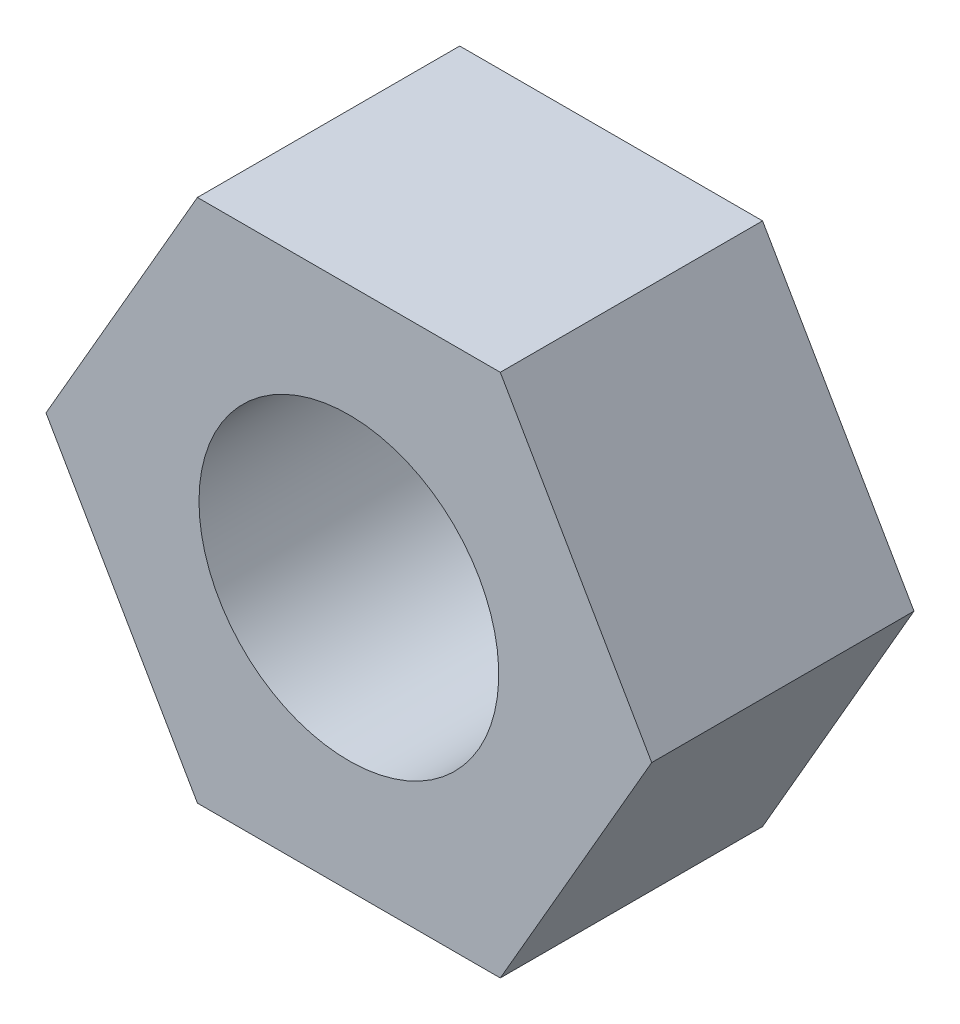
ISO-10303-21;
HEADER;
FILE_DESCRIPTION(('STEP AP214'),'2;1');
FILE_NAME('part.step','',(''),(''),'','','');
FILE_SCHEMA(('AUTOMOTIVE_DESIGN { 1 0 10303 214 1 1 1 1 }'));
ENDSEC;
DATA;
#1=APPLICATION_CONTEXT('core data for automotive mechanical design processes');
#2=APPLICATION_PROTOCOL_DEFINITION('international standard','automotive_design',2000,#1);
#3=PRODUCT_CONTEXT('',#1,'mechanical');
#4=PRODUCT('Part','Part','',(#3));
#5=PRODUCT_RELATED_PRODUCT_CATEGORY('part','',(#4));
#6=PRODUCT_DEFINITION_FORMATION('','',#4);
#7=PRODUCT_DEFINITION_CONTEXT('part definition',#1,'design');
#8=PRODUCT_DEFINITION('design','',#6,#7);
#9=PRODUCT_DEFINITION_SHAPE('','',#8);
#10=(LENGTH_UNIT() NAMED_UNIT(*) SI_UNIT(.MILLI.,.METRE.));
#11=(NAMED_UNIT(*) PLANE_ANGLE_UNIT() SI_UNIT($,.RADIAN.));
#12=(NAMED_UNIT(*) SI_UNIT($,.STERADIAN.) SOLID_ANGLE_UNIT());
#13=UNCERTAINTY_MEASURE_WITH_UNIT(LENGTH_MEASURE(1.E-05),#10,'distance_accuracy_value','');
#14=(GEOMETRIC_REPRESENTATION_CONTEXT(3) GLOBAL_UNCERTAINTY_ASSIGNED_CONTEXT((#13)) GLOBAL_UNIT_ASSIGNED_CONTEXT((#10,
#11,#12)) REPRESENTATION_CONTEXT('',''));
#15=CARTESIAN_POINT('',(0.,0.,0.));
#16=DIRECTION('',(0.,0.,1.));
#17=DIRECTION('',(1.,0.,0.));
#18=AXIS2_PLACEMENT_3D('',#15,#16,#17);
#19=CARTESIAN_POINT('',(-205.305755723831,4.71844785465692E-13,0.));
#20=DIRECTION('',(-0.86602540378444,-0.499999999999998,0.));
#21=DIRECTION('',(0.499999999999998,-0.86602540378444,0.));
#22=AXIS2_PLACEMENT_3D('',#19,#20,#21);
#23=PLANE('',#22);
#24=DIRECTION('',(0.499999999999998,-0.86602540378444,0.));
#25=VECTOR('',#24,1.);
#26=CARTESIAN_POINT('',(-205.305755723831,4.71844785465692E-13,177.8));
#27=LINE('',#26,#25);
#28=CARTESIAN_POINT('',(-205.305755723831,4.71844785465692E-13,177.8));
#29=VERTEX_POINT('',#28);
#30=CARTESIAN_POINT('',(-102.652877861916,-177.8,177.8));
#31=VERTEX_POINT('',#30);
#32=EDGE_CURVE('E132',#29,#31,#27,.T.);
#33=ORIENTED_EDGE('',*,*,#32,.F.);
#34=DIRECTION('',(0.,0.,1.));
#35=VECTOR('',#34,1.);
#36=CARTESIAN_POINT('',(-205.305755723831,4.71844785465692E-13,0.));
#37=LINE('',#36,#35);
#38=CARTESIAN_POINT('',(-205.305755723831,4.71844785465692E-13,0.));
#39=VERTEX_POINT('',#38);
#40=EDGE_CURVE('E13',#39,#29,#37,.T.);
#41=ORIENTED_EDGE('',*,*,#40,.F.);
#42=DIRECTION('',(0.499999999999998,-0.86602540378444,0.));
#43=VECTOR('',#42,1.);
#44=CARTESIAN_POINT('',(-205.305755723831,4.71844785465692E-13,0.));
#45=LINE('',#44,#43);
#46=CARTESIAN_POINT('',(-102.652877861916,-177.8,0.));
#47=VERTEX_POINT('',#46);
#48=EDGE_CURVE('E147',#39,#47,#45,.T.);
#49=ORIENTED_EDGE('',*,*,#48,.T.);
#50=DIRECTION('',(0.,0.,1.));
#51=VECTOR('',#50,1.);
#52=CARTESIAN_POINT('',(-102.652877861916,-177.8,0.));
#53=LINE('',#52,#51);
#54=EDGE_CURVE('E50',#47,#31,#53,.T.);
#55=ORIENTED_EDGE('',*,*,#54,.T.);
#56=EDGE_LOOP('',(#33,#41,#49,#55));
#57=FACE_BOUND('',#56,.T.);
#58=ADVANCED_FACE('F47',(#57),#23,.T.);
#59=CARTESIAN_POINT('',(-102.652877861915,177.8,0.));
#60=DIRECTION('',(-0.866025403784438,0.500000000000002,0.));
#61=DIRECTION('',(-0.500000000000002,-0.866025403784438,0.));
#62=AXIS2_PLACEMENT_3D('',#59,#60,#61);
#63=PLANE('',#62);
#64=DIRECTION('',(-0.500000000000002,-0.866025403784438,0.));
#65=VECTOR('',#64,1.);
#66=CARTESIAN_POINT('',(-102.652877861915,177.8,177.8));
#67=LINE('',#66,#65);
#68=CARTESIAN_POINT('',(-102.652877861915,177.8,177.8));
#69=VERTEX_POINT('',#68);
#70=EDGE_CURVE('E145',#69,#29,#67,.T.);
#71=ORIENTED_EDGE('',*,*,#70,.F.);
#72=DIRECTION('',(0.,0.,1.));
#73=VECTOR('',#72,1.);
#74=CARTESIAN_POINT('',(-102.652877861915,177.8,0.));
#75=LINE('',#74,#73);
#76=CARTESIAN_POINT('',(-102.652877861915,177.8,0.));
#77=VERTEX_POINT('',#76);
#78=EDGE_CURVE('E56',#77,#69,#75,.T.);
#79=ORIENTED_EDGE('',*,*,#78,.F.);
#80=DIRECTION('',(-0.500000000000002,-0.866025403784438,0.));
#81=VECTOR('',#80,1.);
#82=CARTESIAN_POINT('',(-102.652877861915,177.8,0.));
#83=LINE('',#82,#81);
#84=EDGE_CURVE('E122',#77,#39,#83,.T.);
#85=ORIENTED_EDGE('',*,*,#84,.T.);
#86=ORIENTED_EDGE('',*,*,#40,.T.);
#87=EDGE_LOOP('',(#71,#79,#85,#86));
#88=FACE_BOUND('',#87,.T.);
#89=ADVANCED_FACE('F155',(#88),#63,.T.);
#90=CARTESIAN_POINT('',(102.652877861916,177.8,0.));
#91=DIRECTION('',(0.,1.,0.));
#92=DIRECTION('',(-1.,0.,0.));
#93=AXIS2_PLACEMENT_3D('',#90,#91,#92);
#94=PLANE('',#93);
#95=DIRECTION('',(-1.,0.,0.));
#96=VECTOR('',#95,1.);
#97=CARTESIAN_POINT('',(102.652877861916,177.8,177.8));
#98=LINE('',#97,#96);
#99=CARTESIAN_POINT('',(102.652877861916,177.8,177.8));
#100=VERTEX_POINT('',#99);
#101=EDGE_CURVE('E109',#100,#69,#98,.T.);
#102=ORIENTED_EDGE('',*,*,#101,.F.);
#103=DIRECTION('',(0.,0.,1.));
#104=VECTOR('',#103,1.);
#105=CARTESIAN_POINT('',(102.652877861916,177.8,0.));
#106=LINE('',#105,#104);
#107=CARTESIAN_POINT('',(102.652877861916,177.8,0.));
#108=VERTEX_POINT('',#107);
#109=EDGE_CURVE('E104',#108,#100,#106,.T.);
#110=ORIENTED_EDGE('',*,*,#109,.F.);
#111=DIRECTION('',(-1.,0.,0.));
#112=VECTOR('',#111,1.);
#113=CARTESIAN_POINT('',(102.652877861916,177.8,0.));
#114=LINE('',#113,#112);
#115=EDGE_CURVE('E107',#108,#77,#114,.T.);
#116=ORIENTED_EDGE('',*,*,#115,.T.);
#117=ORIENTED_EDGE('',*,*,#78,.T.);
#118=EDGE_LOOP('',(#102,#110,#116,#117));
#119=FACE_BOUND('',#118,.T.);
#120=ADVANCED_FACE('F106',(#119),#94,.T.);
#121=CARTESIAN_POINT('',(205.305755723831,0.,0.));
#122=DIRECTION('',(0.866025403784439,0.5,0.));
#123=DIRECTION('',(-0.5,0.866025403784439,0.));
#124=AXIS2_PLACEMENT_3D('',#121,#122,#123);
#125=PLANE('',#124);
#126=DIRECTION('',(-0.5,0.866025403784439,0.));
#127=VECTOR('',#126,1.);
#128=CARTESIAN_POINT('',(205.305755723831,0.,177.8));
#129=LINE('',#128,#127);
#130=CARTESIAN_POINT('',(205.305755723831,0.,177.8));
#131=VERTEX_POINT('',#130);
#132=EDGE_CURVE('E142',#131,#100,#129,.T.);
#133=ORIENTED_EDGE('',*,*,#132,.F.);
#134=DIRECTION('',(0.,0.,1.));
#135=VECTOR('',#134,1.);
#136=CARTESIAN_POINT('',(205.305755723831,0.,0.));
#137=LINE('',#136,#135);
#138=CARTESIAN_POINT('',(205.305755723831,0.,0.));
#139=VERTEX_POINT('',#138);
#140=EDGE_CURVE('E114',#139,#131,#137,.T.);
#141=ORIENTED_EDGE('',*,*,#140,.F.);
#142=DIRECTION('',(-0.5,0.866025403784439,0.));
#143=VECTOR('',#142,1.);
#144=CARTESIAN_POINT('',(205.305755723831,0.,0.));
#145=LINE('',#144,#143);
#146=EDGE_CURVE('E120',#139,#108,#145,.T.);
#147=ORIENTED_EDGE('',*,*,#146,.T.);
#148=ORIENTED_EDGE('',*,*,#109,.T.);
#149=EDGE_LOOP('',(#133,#141,#147,#148));
#150=FACE_BOUND('',#149,.T.);
#151=ADVANCED_FACE('F124',(#150),#125,.T.);
#152=CARTESIAN_POINT('',(102.652877861915,-177.8,0.));
#153=DIRECTION('',(0.866025403784438,-0.500000000000002,0.));
#154=DIRECTION('',(0.500000000000002,0.866025403784438,0.));
#155=AXIS2_PLACEMENT_3D('',#152,#153,#154);
#156=PLANE('',#155);
#157=DIRECTION('',(0.500000000000002,0.866025403784438,0.));
#158=VECTOR('',#157,1.);
#159=CARTESIAN_POINT('',(102.652877861915,-177.8,177.8));
#160=LINE('',#159,#158);
#161=CARTESIAN_POINT('',(102.652877861915,-177.8,177.8));
#162=VERTEX_POINT('',#161);
#163=EDGE_CURVE('E139',#162,#131,#160,.T.);
#164=ORIENTED_EDGE('',*,*,#163,.F.);
#165=DIRECTION('',(0.,0.,1.));
#166=VECTOR('',#165,1.);
#167=CARTESIAN_POINT('',(102.652877861915,-177.8,0.));
#168=LINE('',#167,#166);
#169=CARTESIAN_POINT('',(102.652877861915,-177.8,0.));
#170=VERTEX_POINT('',#169);
#171=EDGE_CURVE('E150',#170,#162,#168,.T.);
#172=ORIENTED_EDGE('',*,*,#171,.F.);
#173=DIRECTION('',(0.500000000000002,0.866025403784438,0.));
#174=VECTOR('',#173,1.);
#175=CARTESIAN_POINT('',(102.652877861915,-177.8,0.));
#176=LINE('',#175,#174);
#177=EDGE_CURVE('E125',#170,#139,#176,.T.);
#178=ORIENTED_EDGE('',*,*,#177,.T.);
#179=ORIENTED_EDGE('',*,*,#140,.T.);
#180=EDGE_LOOP('',(#164,#172,#178,#179));
#181=FACE_BOUND('',#180,.T.);
#182=ADVANCED_FACE('F168',(#181),#156,.T.);
#183=CARTESIAN_POINT('',(-102.652877861916,-177.8,0.));
#184=DIRECTION('',(0.,-1.,0.));
#185=DIRECTION('',(1.,0.,0.));
#186=AXIS2_PLACEMENT_3D('',#183,#184,#185);
#187=PLANE('',#186);
#188=DIRECTION('',(1.,0.,0.));
#189=VECTOR('',#188,1.);
#190=CARTESIAN_POINT('',(-102.652877861916,-177.8,177.8));
#191=LINE('',#190,#189);
#192=EDGE_CURVE('E135',#31,#162,#191,.T.);
#193=ORIENTED_EDGE('',*,*,#192,.F.);
#194=ORIENTED_EDGE('',*,*,#54,.F.);
#195=DIRECTION('',(1.,0.,0.));
#196=VECTOR('',#195,1.);
#197=CARTESIAN_POINT('',(-102.652877861916,-177.8,0.));
#198=LINE('',#197,#196);
#199=EDGE_CURVE('E127',#47,#170,#198,.T.);
#200=ORIENTED_EDGE('',*,*,#199,.T.);
#201=ORIENTED_EDGE('',*,*,#171,.T.);
#202=EDGE_LOOP('',(#193,#194,#200,#201));
#203=FACE_BOUND('',#202,.T.);
#204=ADVANCED_FACE('F152',(#203),#187,.T.);
#205=CARTESIAN_POINT('',(0.,0.,0.));
#206=DIRECTION('',(0.,0.,1.));
#207=DIRECTION('',(1.,0.,0.));
#208=AXIS2_PLACEMENT_3D('',#205,#206,#207);
#209=PLANE('',#208);
#210=CARTESIAN_POINT('',(0.,0.,0.));
#211=DIRECTION('',(0.,0.,1.));
#212=DIRECTION('',(-1.,0.,0.));
#213=AXIS2_PLACEMENT_3D('',#210,#211,#212);
#214=CIRCLE('',#213,101.6);
#215=CARTESIAN_POINT('',(-101.6,0.,0.));
#216=VERTEX_POINT('',#215);
#217=EDGE_CURVE('E136',#216,#216,#214,.T.);
#218=ORIENTED_EDGE('',*,*,#217,.T.);
#219=EDGE_LOOP('',(#218));
#220=FACE_BOUND('',#219,.T.);
#221=ORIENTED_EDGE('',*,*,#48,.F.);
#222=ORIENTED_EDGE('',*,*,#84,.F.);
#223=ORIENTED_EDGE('',*,*,#115,.F.);
#224=ORIENTED_EDGE('',*,*,#146,.F.);
#225=ORIENTED_EDGE('',*,*,#177,.F.);
#226=ORIENTED_EDGE('',*,*,#199,.F.);
#227=EDGE_LOOP('',(#221,#222,#223,#224,#225,#226));
#228=FACE_BOUND('',#227,.T.);
#229=ADVANCED_FACE('F118',(#220,#228),#209,.F.);
#230=CARTESIAN_POINT('',(0.,0.,177.8));
#231=DIRECTION('',(0.,0.,1.));
#232=DIRECTION('',(1.,0.,0.));
#233=AXIS2_PLACEMENT_3D('',#230,#231,#232);
#234=PLANE('',#233);
#235=CARTESIAN_POINT('',(0.,0.,177.8));
#236=DIRECTION('',(0.,0.,1.));
#237=DIRECTION('',(-1.,0.,0.));
#238=AXIS2_PLACEMENT_3D('',#235,#236,#237);
#239=CIRCLE('',#238,101.6);
#240=CARTESIAN_POINT('',(-101.6,0.,177.8));
#241=VERTEX_POINT('',#240);
#242=EDGE_CURVE('E191',#241,#241,#239,.T.);
#243=ORIENTED_EDGE('',*,*,#242,.F.);
#244=EDGE_LOOP('',(#243));
#245=FACE_BOUND('',#244,.T.);
#246=ORIENTED_EDGE('',*,*,#32,.T.);
#247=ORIENTED_EDGE('',*,*,#192,.T.);
#248=ORIENTED_EDGE('',*,*,#163,.T.);
#249=ORIENTED_EDGE('',*,*,#132,.T.);
#250=ORIENTED_EDGE('',*,*,#101,.T.);
#251=ORIENTED_EDGE('',*,*,#70,.T.);
#252=EDGE_LOOP('',(#246,#247,#248,#249,#250,#251));
#253=FACE_BOUND('',#252,.T.);
#254=ADVANCED_FACE('F154',(#245,#253),#234,.T.);
#255=CARTESIAN_POINT('',(0.,0.,0.));
#256=DIRECTION('',(0.,0.,1.));
#257=DIRECTION('',(1.,0.,0.));
#258=AXIS2_PLACEMENT_3D('',#255,#256,#257);
#259=CYLINDRICAL_SURFACE('',#258,101.6);
#260=ORIENTED_EDGE('',*,*,#217,.F.);
#261=EDGE_LOOP('',(#260));
#262=FACE_BOUND('',#261,.T.);
#263=ORIENTED_EDGE('',*,*,#242,.T.);
#264=EDGE_LOOP('',(#263));
#265=FACE_BOUND('',#264,.T.);
#266=ADVANCED_FACE('F179',(#262,#265),#259,.F.);
#267=CLOSED_SHELL('',(#58,#89,#120,#151,#182,#204,#229,#254,#266));
#268=MANIFOLD_SOLID_BREP('B2',#267);
#269=ADVANCED_BREP_SHAPE_REPRESENTATION('',(#18,#268),#14);
#270=SHAPE_DEFINITION_REPRESENTATION(#9,#269);
ENDSEC;
END-ISO-10303-21;
